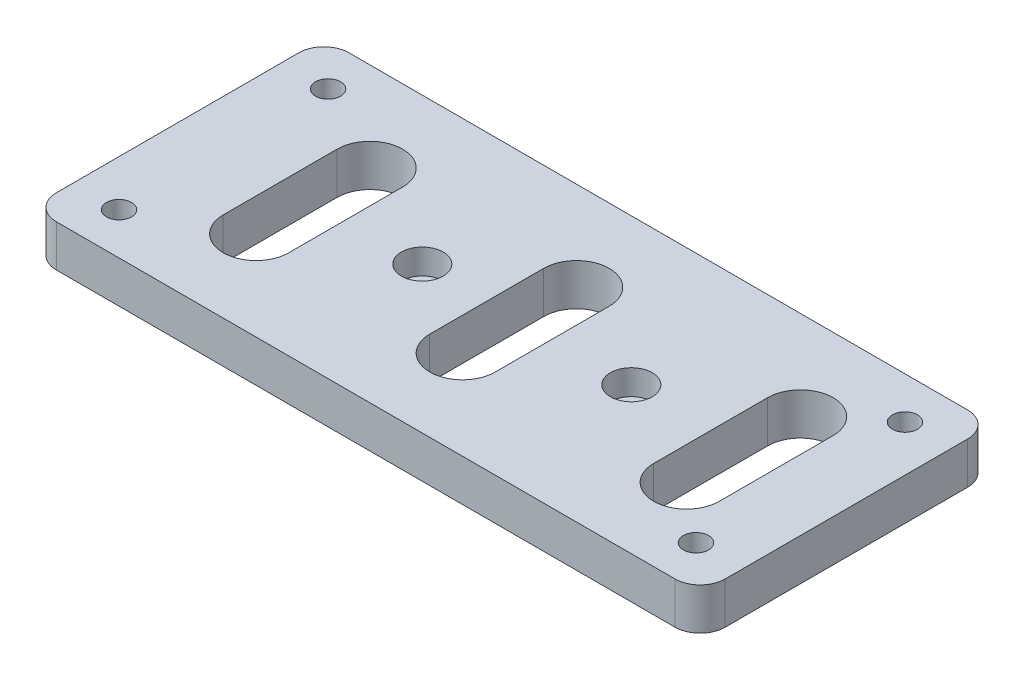
ISO-10303-21;
HEADER;
FILE_DESCRIPTION(('STEP AP214'),'2;1');
FILE_NAME('part.step','',(''),(''),'','','');
FILE_SCHEMA(('AUTOMOTIVE_DESIGN { 1 0 10303 214 1 1 1 1 }'));
ENDSEC;
DATA;
#1=APPLICATION_CONTEXT('core data for automotive mechanical design processes');
#2=APPLICATION_PROTOCOL_DEFINITION('international standard','automotive_design',2000,#1);
#3=PRODUCT_CONTEXT('',#1,'mechanical');
#4=PRODUCT('Part','Part','',(#3));
#5=PRODUCT_RELATED_PRODUCT_CATEGORY('part','',(#4));
#6=PRODUCT_DEFINITION_FORMATION('','',#4);
#7=PRODUCT_DEFINITION_CONTEXT('part definition',#1,'design');
#8=PRODUCT_DEFINITION('design','',#6,#7);
#9=PRODUCT_DEFINITION_SHAPE('','',#8);
#10=(LENGTH_UNIT() NAMED_UNIT(*) SI_UNIT(.MILLI.,.METRE.));
#11=(NAMED_UNIT(*) PLANE_ANGLE_UNIT() SI_UNIT($,.RADIAN.));
#12=(NAMED_UNIT(*) SI_UNIT($,.STERADIAN.) SOLID_ANGLE_UNIT());
#13=UNCERTAINTY_MEASURE_WITH_UNIT(LENGTH_MEASURE(1.E-05),#10,'distance_accuracy_value','');
#14=(GEOMETRIC_REPRESENTATION_CONTEXT(3) GLOBAL_UNCERTAINTY_ASSIGNED_CONTEXT((#13)) GLOBAL_UNIT_ASSIGNED_CONTEXT((#10,
#11,#12)) REPRESENTATION_CONTEXT('',''));
#15=CARTESIAN_POINT('',(0.,0.,0.));
#16=DIRECTION('',(0.,0.,1.));
#17=DIRECTION('',(1.,0.,0.));
#18=AXIS2_PLACEMENT_3D('',#15,#16,#17);
#19=CARTESIAN_POINT('',(54.270489511946,0.,-17.5));
#20=DIRECTION('',(0.,1.,0.));
#21=DIRECTION('',(0.,0.,1.));
#22=AXIS2_PLACEMENT_3D('',#19,#20,#21);
#23=CYLINDRICAL_SURFACE('',#22,1.29999999999999);
#24=CARTESIAN_POINT('',(54.270489511946,0.,-17.5));
#25=DIRECTION('',(0.,1.,0.));
#26=DIRECTION('',(0.,0.,1.));
#27=AXIS2_PLACEMENT_3D('',#24,#25,#26);
#28=CIRCLE('',#27,1.29999999999999);
#29=CARTESIAN_POINT('',(54.270489511946,0.,-16.2));
#30=VERTEX_POINT('',#29);
#31=EDGE_CURVE('E210',#30,#30,#28,.T.);
#32=ORIENTED_EDGE('',*,*,#31,.F.);
#33=EDGE_LOOP('',(#32));
#34=FACE_BOUND('',#33,.T.);
#35=CARTESIAN_POINT('',(54.270489511946,2.,-17.5));
#36=DIRECTION('',(0.,1.,0.));
#37=DIRECTION('',(0.,0.,1.));
#38=AXIS2_PLACEMENT_3D('',#35,#36,#37);
#39=CIRCLE('',#38,1.29999999999999);
#40=CARTESIAN_POINT('',(54.270489511946,2.,-16.2));
#41=VERTEX_POINT('',#40);
#42=EDGE_CURVE('E272',#41,#41,#39,.F.);
#43=ORIENTED_EDGE('',*,*,#42,.F.);
#44=EDGE_LOOP('',(#43));
#45=FACE_BOUND('',#44,.T.);
#46=ADVANCED_FACE('F33',(#34,#45),#23,.F.);
#47=CARTESIAN_POINT('',(29.270489511946,0.,-17.5));
#48=DIRECTION('',(0.,1.,0.));
#49=DIRECTION('',(0.,0.,1.));
#50=AXIS2_PLACEMENT_3D('',#47,#48,#49);
#51=CYLINDRICAL_SURFACE('',#50,1.3);
#52=CARTESIAN_POINT('',(29.270489511946,0.,-17.5));
#53=DIRECTION('',(0.,1.,0.));
#54=DIRECTION('',(0.,0.,1.));
#55=AXIS2_PLACEMENT_3D('',#52,#53,#54);
#56=CIRCLE('',#55,1.3);
#57=CARTESIAN_POINT('',(29.270489511946,0.,-16.2));
#58=VERTEX_POINT('',#57);
#59=EDGE_CURVE('E216',#58,#58,#56,.T.);
#60=ORIENTED_EDGE('',*,*,#59,.F.);
#61=EDGE_LOOP('',(#60));
#62=FACE_BOUND('',#61,.T.);
#63=CARTESIAN_POINT('',(29.270489511946,2.,-17.5));
#64=DIRECTION('',(0.,1.,0.));
#65=DIRECTION('',(0.,0.,1.));
#66=AXIS2_PLACEMENT_3D('',#63,#64,#65);
#67=CIRCLE('',#66,1.3);
#68=CARTESIAN_POINT('',(29.270489511946,2.,-16.2));
#69=VERTEX_POINT('',#68);
#70=EDGE_CURVE('E335',#69,#69,#67,.F.);
#71=ORIENTED_EDGE('',*,*,#70,.F.);
#72=EDGE_LOOP('',(#71));
#73=FACE_BOUND('',#72,.T.);
#74=ADVANCED_FACE('F408',(#62,#73),#51,.F.);
#75=CARTESIAN_POINT('',(0.,5.,0.));
#76=DIRECTION('',(1.,0.,0.));
#77=DIRECTION('',(0.,0.,-1.));
#78=AXIS2_PLACEMENT_3D('',#75,#76,#77);
#79=PLANE('',#78);
#80=DIRECTION('',(0.,0.,1.));
#81=VECTOR('',#80,1.);
#82=CARTESIAN_POINT('',(0.,5.,0.));
#83=LINE('',#82,#81);
#84=CARTESIAN_POINT('',(0.,5.,-32.));
#85=VERTEX_POINT('',#84);
#86=CARTESIAN_POINT('',(0.,5.,-3.));
#87=VERTEX_POINT('',#86);
#88=EDGE_CURVE('E314',#85,#87,#83,.T.);
#89=ORIENTED_EDGE('',*,*,#88,.F.);
#90=DIRECTION('',(0.,-1.,0.));
#91=VECTOR('',#90,1.);
#92=CARTESIAN_POINT('',(0.,5.,-32.));
#93=LINE('',#92,#91);
#94=CARTESIAN_POINT('',(0.,0.,-32.));
#95=VERTEX_POINT('',#94);
#96=EDGE_CURVE('E11',#85,#95,#93,.T.);
#97=ORIENTED_EDGE('',*,*,#96,.T.);
#98=DIRECTION('',(0.,0.,1.));
#99=VECTOR('',#98,1.);
#100=CARTESIAN_POINT('',(0.,0.,0.));
#101=LINE('',#100,#99);
#102=CARTESIAN_POINT('',(0.,0.,-3.));
#103=VERTEX_POINT('',#102);
#104=EDGE_CURVE('E311',#95,#103,#101,.T.);
#105=ORIENTED_EDGE('',*,*,#104,.T.);
#106=DIRECTION('',(0.,-1.,0.));
#107=VECTOR('',#106,1.);
#108=CARTESIAN_POINT('',(0.,5.,-3.));
#109=LINE('',#108,#107);
#110=EDGE_CURVE('E41',#103,#87,#109,.F.);
#111=ORIENTED_EDGE('',*,*,#110,.T.);
#112=EDGE_LOOP('',(#89,#97,#105,#111));
#113=FACE_BOUND('',#112,.T.);
#114=ADVANCED_FACE('F371',(#113),#79,.F.);
#115=CARTESIAN_POINT('',(0.,5.,0.));
#116=DIRECTION('',(0.,0.,-1.));
#117=DIRECTION('',(-1.,0.,0.));
#118=AXIS2_PLACEMENT_3D('',#115,#116,#117);
#119=PLANE('',#118);
#120=DIRECTION('',(1.,0.,0.));
#121=VECTOR('',#120,1.);
#122=CARTESIAN_POINT('',(0.,0.,0.));
#123=LINE('',#122,#121);
#124=CARTESIAN_POINT('',(3.,0.,0.));
#125=VERTEX_POINT('',#124);
#126=CARTESIAN_POINT('',(77.,0.,0.));
#127=VERTEX_POINT('',#126);
#128=EDGE_CURVE('E328',#125,#127,#123,.T.);
#129=ORIENTED_EDGE('',*,*,#128,.T.);
#130=DIRECTION('',(0.,-1.,0.));
#131=VECTOR('',#130,1.);
#132=CARTESIAN_POINT('',(77.,5.,0.));
#133=LINE('',#132,#131);
#134=CARTESIAN_POINT('',(77.,5.,0.));
#135=VERTEX_POINT('',#134);
#136=EDGE_CURVE('E356',#127,#135,#133,.F.);
#137=ORIENTED_EDGE('',*,*,#136,.T.);
#138=DIRECTION('',(1.,0.,0.));
#139=VECTOR('',#138,1.);
#140=CARTESIAN_POINT('',(0.,5.,0.));
#141=LINE('',#140,#139);
#142=CARTESIAN_POINT('',(3.,5.,0.));
#143=VERTEX_POINT('',#142);
#144=EDGE_CURVE('E317',#143,#135,#141,.T.);
#145=ORIENTED_EDGE('',*,*,#144,.F.);
#146=DIRECTION('',(0.,-1.,0.));
#147=VECTOR('',#146,1.);
#148=CARTESIAN_POINT('',(3.,5.,0.));
#149=LINE('',#148,#147);
#150=EDGE_CURVE('E353',#143,#125,#149,.T.);
#151=ORIENTED_EDGE('',*,*,#150,.T.);
#152=EDGE_LOOP('',(#129,#137,#145,#151));
#153=FACE_BOUND('',#152,.T.);
#154=ADVANCED_FACE('F382',(#153),#119,.F.);
#155=CARTESIAN_POINT('',(80.,5.,0.));
#156=DIRECTION('',(-1.,0.,0.));
#157=DIRECTION('',(0.,0.,1.));
#158=AXIS2_PLACEMENT_3D('',#155,#156,#157);
#159=PLANE('',#158);
#160=DIRECTION('',(0.,0.,-1.));
#161=VECTOR('',#160,1.);
#162=CARTESIAN_POINT('',(80.,5.,0.));
#163=LINE('',#162,#161);
#164=CARTESIAN_POINT('',(80.,5.,-3.));
#165=VERTEX_POINT('',#164);
#166=CARTESIAN_POINT('',(80.,5.,-32.));
#167=VERTEX_POINT('',#166);
#168=EDGE_CURVE('E321',#165,#167,#163,.T.);
#169=ORIENTED_EDGE('',*,*,#168,.F.);
#170=DIRECTION('',(0.,-1.,0.));
#171=VECTOR('',#170,1.);
#172=CARTESIAN_POINT('',(80.,5.,-3.));
#173=LINE('',#172,#171);
#174=CARTESIAN_POINT('',(80.,0.,-3.));
#175=VERTEX_POINT('',#174);
#176=EDGE_CURVE('E342',#165,#175,#173,.T.);
#177=ORIENTED_EDGE('',*,*,#176,.T.);
#178=DIRECTION('',(0.,0.,-1.));
#179=VECTOR('',#178,1.);
#180=CARTESIAN_POINT('',(80.,0.,0.));
#181=LINE('',#180,#179);
#182=CARTESIAN_POINT('',(80.,0.,-32.));
#183=VERTEX_POINT('',#182);
#184=EDGE_CURVE('E331',#175,#183,#181,.T.);
#185=ORIENTED_EDGE('',*,*,#184,.T.);
#186=DIRECTION('',(0.,-1.,0.));
#187=VECTOR('',#186,1.);
#188=CARTESIAN_POINT('',(80.,5.,-32.));
#189=LINE('',#188,#187);
#190=EDGE_CURVE('E325',#183,#167,#189,.F.);
#191=ORIENTED_EDGE('',*,*,#190,.T.);
#192=EDGE_LOOP('',(#169,#177,#185,#191));
#193=FACE_BOUND('',#192,.T.);
#194=ADVANCED_FACE('F392',(#193),#159,.F.);
#195=CARTESIAN_POINT('',(0.,5.,-35.));
#196=DIRECTION('',(0.,0.,1.));
#197=DIRECTION('',(1.,0.,0.));
#198=AXIS2_PLACEMENT_3D('',#195,#196,#197);
#199=PLANE('',#198);
#200=DIRECTION('',(-1.,0.,0.));
#201=VECTOR('',#200,1.);
#202=CARTESIAN_POINT('',(0.,5.,-35.));
#203=LINE('',#202,#201);
#204=CARTESIAN_POINT('',(77.,5.,-35.));
#205=VERTEX_POINT('',#204);
#206=CARTESIAN_POINT('',(3.,5.,-35.));
#207=VERTEX_POINT('',#206);
#208=EDGE_CURVE('E323',#205,#207,#203,.T.);
#209=ORIENTED_EDGE('',*,*,#208,.F.);
#210=DIRECTION('',(0.,-1.,0.));
#211=VECTOR('',#210,1.);
#212=CARTESIAN_POINT('',(77.,5.,-35.));
#213=LINE('',#212,#211);
#214=CARTESIAN_POINT('',(77.,0.,-35.));
#215=VERTEX_POINT('',#214);
#216=EDGE_CURVE('E366',#205,#215,#213,.T.);
#217=ORIENTED_EDGE('',*,*,#216,.T.);
#218=DIRECTION('',(-1.,0.,0.));
#219=VECTOR('',#218,1.);
#220=CARTESIAN_POINT('',(0.,0.,-35.));
#221=LINE('',#220,#219);
#222=CARTESIAN_POINT('',(3.,0.,-35.));
#223=VERTEX_POINT('',#222);
#224=EDGE_CURVE('E318',#215,#223,#221,.T.);
#225=ORIENTED_EDGE('',*,*,#224,.T.);
#226=DIRECTION('',(0.,-1.,0.));
#227=VECTOR('',#226,1.);
#228=CARTESIAN_POINT('',(3.,5.,-35.));
#229=LINE('',#228,#227);
#230=EDGE_CURVE('E48',#223,#207,#229,.F.);
#231=ORIENTED_EDGE('',*,*,#230,.T.);
#232=EDGE_LOOP('',(#209,#217,#225,#231));
#233=FACE_BOUND('',#232,.T.);
#234=ADVANCED_FACE('F398',(#233),#199,.F.);
#235=CARTESIAN_POINT('',(0.,5.,0.));
#236=DIRECTION('',(0.,-1.,0.));
#237=DIRECTION('',(0.,0.,-1.));
#238=AXIS2_PLACEMENT_3D('',#235,#236,#237);
#239=PLANE('',#238);
#240=CARTESIAN_POINT('',(29.270489511946,5.,-17.5));
#241=DIRECTION('',(0.,1.,0.));
#242=DIRECTION('',(0.,0.,1.));
#243=AXIS2_PLACEMENT_3D('',#240,#241,#242);
#244=CIRCLE('',#243,2.49999999999999);
#245=CARTESIAN_POINT('',(29.270489511946,5.,-15.));
#246=VERTEX_POINT('',#245);
#247=EDGE_CURVE('E705',#246,#246,#244,.T.);
#248=ORIENTED_EDGE('',*,*,#247,.F.);
#249=EDGE_LOOP('',(#248));
#250=FACE_BOUND('',#249,.T.);
#251=CARTESIAN_POINT('',(54.270489511946,5.,-17.5));
#252=DIRECTION('',(0.,1.,0.));
#253=DIRECTION('',(0.,0.,1.));
#254=AXIS2_PLACEMENT_3D('',#251,#252,#253);
#255=CIRCLE('',#254,2.49999999999999);
#256=CARTESIAN_POINT('',(54.270489511946,5.,-15.));
#257=VERTEX_POINT('',#256);
#258=EDGE_CURVE('E203',#257,#257,#255,.T.);
#259=ORIENTED_EDGE('',*,*,#258,.F.);
#260=EDGE_LOOP('',(#259));
#261=FACE_BOUND('',#260,.T.);
#262=CARTESIAN_POINT('',(74.5,5.,-30.));
#263=DIRECTION('',(0.,1.,0.));
#264=DIRECTION('',(0.,0.,1.));
#265=AXIS2_PLACEMENT_3D('',#262,#263,#264);
#266=CIRCLE('',#265,1.5);
#267=CARTESIAN_POINT('',(74.5,5.,-28.5));
#268=VERTEX_POINT('',#267);
#269=EDGE_CURVE('E291',#268,#268,#266,.T.);
#270=ORIENTED_EDGE('',*,*,#269,.F.);
#271=EDGE_LOOP('',(#270));
#272=FACE_BOUND('',#271,.T.);
#273=CARTESIAN_POINT('',(74.5,5.,-5.));
#274=DIRECTION('',(0.,1.,0.));
#275=DIRECTION('',(0.,0.,1.));
#276=AXIS2_PLACEMENT_3D('',#273,#274,#275);
#277=CIRCLE('',#276,1.5);
#278=CARTESIAN_POINT('',(74.5,5.,-3.5));
#279=VERTEX_POINT('',#278);
#280=EDGE_CURVE('E297',#279,#279,#277,.T.);
#281=ORIENTED_EDGE('',*,*,#280,.F.);
#282=EDGE_LOOP('',(#281));
#283=FACE_BOUND('',#282,.T.);
#284=CARTESIAN_POINT('',(5.49999999999999,5.,-5.));
#285=DIRECTION('',(0.,1.,0.));
#286=DIRECTION('',(0.,0.,1.));
#287=AXIS2_PLACEMENT_3D('',#284,#285,#286);
#288=CIRCLE('',#287,1.5);
#289=CARTESIAN_POINT('',(5.49999999999999,5.,-3.5));
#290=VERTEX_POINT('',#289);
#291=EDGE_CURVE('E303',#290,#290,#288,.T.);
#292=ORIENTED_EDGE('',*,*,#291,.F.);
#293=EDGE_LOOP('',(#292));
#294=FACE_BOUND('',#293,.T.);
#295=DIRECTION('',(0.,0.,1.));
#296=VECTOR('',#295,1.);
#297=CARTESIAN_POINT('',(63.7583956599308,5.,-24.3103814107303));
#298=LINE('',#297,#296);
#299=CARTESIAN_POINT('',(63.7583956599308,5.,-24.3103814107303));
#300=VERTEX_POINT('',#299);
#301=CARTESIAN_POINT('',(63.7583956599308,5.,-10.6896185892697));
#302=VERTEX_POINT('',#301);
#303=EDGE_CURVE('E209',#300,#302,#298,.T.);
#304=ORIENTED_EDGE('',*,*,#303,.F.);
#305=CARTESIAN_POINT('',(67.6804486617196,5.,-24.3103814107303));
#306=DIRECTION('',(0.,1.,0.));
#307=DIRECTION('',(0.,0.,1.));
#308=AXIS2_PLACEMENT_3D('',#305,#306,#307);
#309=CIRCLE('',#308,3.92205300178881);
#310=CARTESIAN_POINT('',(71.6025016635084,5.,-24.3103814107303));
#311=VERTEX_POINT('',#310);
#312=EDGE_CURVE('E179',#311,#300,#309,.T.);
#313=ORIENTED_EDGE('',*,*,#312,.F.);
#314=DIRECTION('',(0.,0.,-1.));
#315=VECTOR('',#314,1.);
#316=CARTESIAN_POINT('',(71.6025016635084,5.,-24.3103814107303));
#317=LINE('',#316,#315);
#318=CARTESIAN_POINT('',(71.6025016635084,5.,-10.6896185892697));
#319=VERTEX_POINT('',#318);
#320=EDGE_CURVE('E197',#319,#311,#317,.T.);
#321=ORIENTED_EDGE('',*,*,#320,.F.);
#322=CARTESIAN_POINT('',(67.6804486617196,5.,-10.6896185892697));
#323=DIRECTION('',(0.,1.,0.));
#324=DIRECTION('',(0.,0.,1.));
#325=AXIS2_PLACEMENT_3D('',#322,#323,#324);
#326=CIRCLE('',#325,3.92205300178881);
#327=EDGE_CURVE('E200',#302,#319,#326,.T.);
#328=ORIENTED_EDGE('',*,*,#327,.F.);
#329=EDGE_LOOP('',(#304,#313,#321,#328));
#330=FACE_BOUND('',#329,.T.);
#331=DIRECTION('',(0.,0.,1.));
#332=VECTOR('',#331,1.);
#333=CARTESIAN_POINT('',(36.9716081370752,5.,-24.3103814107303));
#334=LINE('',#333,#332);
#335=CARTESIAN_POINT('',(36.9716081370752,5.,-24.3103814107303));
#336=VERTEX_POINT('',#335);
#337=CARTESIAN_POINT('',(36.9716081370752,5.,-10.6896185892697));
#338=VERTEX_POINT('',#337);
#339=EDGE_CURVE('E239',#336,#338,#334,.T.);
#340=ORIENTED_EDGE('',*,*,#339,.F.);
#341=CARTESIAN_POINT('',(40.8936611388641,5.,-24.3103814107303));
#342=DIRECTION('',(0.,1.,0.));
#343=DIRECTION('',(0.,0.,1.));
#344=AXIS2_PLACEMENT_3D('',#341,#342,#343);
#345=CIRCLE('',#344,3.92205300178882);
#346=CARTESIAN_POINT('',(44.8157141406529,5.,-24.3103814107303));
#347=VERTEX_POINT('',#346);
#348=EDGE_CURVE('E237',#347,#336,#345,.T.);
#349=ORIENTED_EDGE('',*,*,#348,.F.);
#350=DIRECTION('',(0.,0.,-1.));
#351=VECTOR('',#350,1.);
#352=CARTESIAN_POINT('',(44.8157141406529,5.,-24.3103814107303));
#353=LINE('',#352,#351);
#354=CARTESIAN_POINT('',(44.8157141406529,5.,-10.6896185892697));
#355=VERTEX_POINT('',#354);
#356=EDGE_CURVE('E227',#355,#347,#353,.T.);
#357=ORIENTED_EDGE('',*,*,#356,.F.);
#358=CARTESIAN_POINT('',(40.8936611388641,5.,-10.6896185892697));
#359=DIRECTION('',(0.,1.,0.));
#360=DIRECTION('',(0.,0.,1.));
#361=AXIS2_PLACEMENT_3D('',#358,#359,#360);
#362=CIRCLE('',#361,3.92205300178882);
#363=EDGE_CURVE('E243',#338,#355,#362,.T.);
#364=ORIENTED_EDGE('',*,*,#363,.F.);
#365=EDGE_LOOP('',(#340,#349,#357,#364));
#366=FACE_BOUND('',#365,.T.);
#367=DIRECTION('',(0.,0.,1.));
#368=VECTOR('',#367,1.);
#369=CARTESIAN_POINT('',(12.2710190194265,5.,-24.3103814107303));
#370=LINE('',#369,#368);
#371=CARTESIAN_POINT('',(12.2710190194265,5.,-24.3103814107303));
#372=VERTEX_POINT('',#371);
#373=CARTESIAN_POINT('',(12.2710190194265,5.,-10.6896185892697));
#374=VERTEX_POINT('',#373);
#375=EDGE_CURVE('E271',#372,#374,#370,.T.);
#376=ORIENTED_EDGE('',*,*,#375,.F.);
#377=CARTESIAN_POINT('',(16.1930720212153,5.,-24.3103814107303));
#378=DIRECTION('',(0.,1.,0.));
#379=DIRECTION('',(0.,0.,1.));
#380=AXIS2_PLACEMENT_3D('',#377,#378,#379);
#381=CIRCLE('',#380,3.92205300178881);
#382=CARTESIAN_POINT('',(20.1151250230041,5.,-24.3103814107303));
#383=VERTEX_POINT('',#382);
#384=EDGE_CURVE('E269',#383,#372,#381,.T.);
#385=ORIENTED_EDGE('',*,*,#384,.F.);
#386=DIRECTION('',(0.,0.,-1.));
#387=VECTOR('',#386,1.);
#388=CARTESIAN_POINT('',(20.1151250230041,5.,-24.3103814107303));
#389=LINE('',#388,#387);
#390=CARTESIAN_POINT('',(20.1151250230041,5.,-10.6896185892697));
#391=VERTEX_POINT('',#390);
#392=EDGE_CURVE('E259',#391,#383,#389,.T.);
#393=ORIENTED_EDGE('',*,*,#392,.F.);
#394=CARTESIAN_POINT('',(16.1930720212153,5.,-10.6896185892697));
#395=DIRECTION('',(0.,1.,0.));
#396=DIRECTION('',(0.,0.,1.));
#397=AXIS2_PLACEMENT_3D('',#394,#395,#396);
#398=CIRCLE('',#397,3.92205300178881);
#399=EDGE_CURVE('E275',#374,#391,#398,.T.);
#400=ORIENTED_EDGE('',*,*,#399,.F.);
#401=EDGE_LOOP('',(#376,#385,#393,#400));
#402=FACE_BOUND('',#401,.T.);
#403=CARTESIAN_POINT('',(5.49999999999999,5.,-30.));
#404=DIRECTION('',(0.,1.,0.));
#405=DIRECTION('',(0.,0.,1.));
#406=AXIS2_PLACEMENT_3D('',#403,#404,#405);
#407=CIRCLE('',#406,1.5);
#408=CARTESIAN_POINT('',(5.49999999999999,5.,-28.5));
#409=VERTEX_POINT('',#408);
#410=EDGE_CURVE('E290',#409,#409,#407,.T.);
#411=ORIENTED_EDGE('',*,*,#410,.F.);
#412=EDGE_LOOP('',(#411));
#413=FACE_BOUND('',#412,.T.);
#414=ORIENTED_EDGE('',*,*,#144,.T.);
#415=CARTESIAN_POINT('',(77.,5.,-3.));
#416=DIRECTION('',(0.,-1.,0.));
#417=DIRECTION('',(0.,0.,-1.));
#418=AXIS2_PLACEMENT_3D('',#415,#416,#417);
#419=CIRCLE('',#418,3.);
#420=EDGE_CURVE('E363',#135,#165,#419,.F.);
#421=ORIENTED_EDGE('',*,*,#420,.T.);
#422=ORIENTED_EDGE('',*,*,#168,.T.);
#423=CARTESIAN_POINT('',(77.,5.,-32.));
#424=DIRECTION('',(0.,-1.,0.));
#425=DIRECTION('',(0.,0.,-1.));
#426=AXIS2_PLACEMENT_3D('',#423,#424,#425);
#427=CIRCLE('',#426,3.);
#428=EDGE_CURVE('E55',#167,#205,#427,.F.);
#429=ORIENTED_EDGE('',*,*,#428,.T.);
#430=ORIENTED_EDGE('',*,*,#208,.T.);
#431=CARTESIAN_POINT('',(3.,5.,-32.));
#432=DIRECTION('',(0.,-1.,0.));
#433=DIRECTION('',(0.,0.,-1.));
#434=AXIS2_PLACEMENT_3D('',#431,#432,#433);
#435=CIRCLE('',#434,3.);
#436=EDGE_CURVE('E360',#207,#85,#435,.F.);
#437=ORIENTED_EDGE('',*,*,#436,.T.);
#438=ORIENTED_EDGE('',*,*,#88,.T.);
#439=CARTESIAN_POINT('',(3.,5.,-3.));
#440=DIRECTION('',(0.,-1.,0.));
#441=DIRECTION('',(0.,0.,-1.));
#442=AXIS2_PLACEMENT_3D('',#439,#440,#441);
#443=CIRCLE('',#442,3.);
#444=EDGE_CURVE('E358',#87,#143,#443,.F.);
#445=ORIENTED_EDGE('',*,*,#444,.T.);
#446=EDGE_LOOP('',(#414,#421,#422,#429,#430,#437,#438,#445));
#447=FACE_BOUND('',#446,.T.);
#448=ADVANCED_FACE('F376',(#250,#261,#272,#283,#294,#330,#366,#402,#413,#447),#239,.F.);
#449=CARTESIAN_POINT('',(0.,0.,0.));
#450=DIRECTION('',(0.,-1.,0.));
#451=DIRECTION('',(0.,0.,-1.));
#452=AXIS2_PLACEMENT_3D('',#449,#450,#451);
#453=PLANE('',#452);
#454=CARTESIAN_POINT('',(74.5,0.,-30.));
#455=DIRECTION('',(0.,1.,0.));
#456=DIRECTION('',(0.,0.,1.));
#457=AXIS2_PLACEMENT_3D('',#454,#455,#456);
#458=CIRCLE('',#457,1.5);
#459=CARTESIAN_POINT('',(74.5,0.,-28.5));
#460=VERTEX_POINT('',#459);
#461=EDGE_CURVE('E287',#460,#460,#458,.T.);
#462=ORIENTED_EDGE('',*,*,#461,.T.);
#463=EDGE_LOOP('',(#462));
#464=FACE_BOUND('',#463,.T.);
#465=CARTESIAN_POINT('',(74.5,0.,-5.));
#466=DIRECTION('',(0.,1.,0.));
#467=DIRECTION('',(0.,0.,1.));
#468=AXIS2_PLACEMENT_3D('',#465,#466,#467);
#469=CIRCLE('',#468,1.5);
#470=CARTESIAN_POINT('',(74.5,0.,-3.5));
#471=VERTEX_POINT('',#470);
#472=EDGE_CURVE('E294',#471,#471,#469,.T.);
#473=ORIENTED_EDGE('',*,*,#472,.T.);
#474=EDGE_LOOP('',(#473));
#475=FACE_BOUND('',#474,.T.);
#476=CARTESIAN_POINT('',(5.49999999999999,0.,-5.));
#477=DIRECTION('',(0.,1.,0.));
#478=DIRECTION('',(0.,0.,1.));
#479=AXIS2_PLACEMENT_3D('',#476,#477,#478);
#480=CIRCLE('',#479,1.5);
#481=CARTESIAN_POINT('',(5.49999999999999,0.,-3.5));
#482=VERTEX_POINT('',#481);
#483=EDGE_CURVE('E300',#482,#482,#480,.T.);
#484=ORIENTED_EDGE('',*,*,#483,.T.);
#485=EDGE_LOOP('',(#484));
#486=FACE_BOUND('',#485,.T.);
#487=ORIENTED_EDGE('',*,*,#59,.T.);
#488=EDGE_LOOP('',(#487));
#489=FACE_BOUND('',#488,.T.);
#490=CARTESIAN_POINT('',(67.6804486617196,0.,-24.3103814107303));
#491=DIRECTION('',(0.,1.,0.));
#492=DIRECTION('',(0.,0.,1.));
#493=AXIS2_PLACEMENT_3D('',#490,#491,#492);
#494=CIRCLE('',#493,3.92205300178881);
#495=CARTESIAN_POINT('',(71.6025016635084,0.,-24.3103814107303));
#496=VERTEX_POINT('',#495);
#497=CARTESIAN_POINT('',(63.7583956599308,0.,-24.3103814107303));
#498=VERTEX_POINT('',#497);
#499=EDGE_CURVE('E176',#496,#498,#494,.T.);
#500=ORIENTED_EDGE('',*,*,#499,.T.);
#501=DIRECTION('',(0.,0.,1.));
#502=VECTOR('',#501,1.);
#503=CARTESIAN_POINT('',(63.7583956599308,0.,-24.3103814107303));
#504=LINE('',#503,#502);
#505=CARTESIAN_POINT('',(63.7583956599308,0.,-10.6896185892697));
#506=VERTEX_POINT('',#505);
#507=EDGE_CURVE('E188',#498,#506,#504,.T.);
#508=ORIENTED_EDGE('',*,*,#507,.T.);
#509=CARTESIAN_POINT('',(67.6804486617196,0.,-10.6896185892697));
#510=DIRECTION('',(0.,1.,0.));
#511=DIRECTION('',(0.,0.,1.));
#512=AXIS2_PLACEMENT_3D('',#509,#510,#511);
#513=CIRCLE('',#512,3.92205300178881);
#514=CARTESIAN_POINT('',(71.6025016635084,0.,-10.6896185892697));
#515=VERTEX_POINT('',#514);
#516=EDGE_CURVE('E192',#506,#515,#513,.T.);
#517=ORIENTED_EDGE('',*,*,#516,.T.);
#518=DIRECTION('',(0.,0.,-1.));
#519=VECTOR('',#518,1.);
#520=CARTESIAN_POINT('',(71.6025016635084,0.,-24.3103814107303));
#521=LINE('',#520,#519);
#522=EDGE_CURVE('E184',#515,#496,#521,.T.);
#523=ORIENTED_EDGE('',*,*,#522,.T.);
#524=EDGE_LOOP('',(#500,#508,#517,#523));
#525=FACE_BOUND('',#524,.T.);
#526=ORIENTED_EDGE('',*,*,#31,.T.);
#527=EDGE_LOOP('',(#526));
#528=FACE_BOUND('',#527,.T.);
#529=CARTESIAN_POINT('',(40.8936611388641,0.,-24.3103814107303));
#530=DIRECTION('',(0.,1.,0.));
#531=DIRECTION('',(0.,0.,1.));
#532=AXIS2_PLACEMENT_3D('',#529,#530,#531);
#533=CIRCLE('',#532,3.92205300178882);
#534=CARTESIAN_POINT('',(44.8157141406529,0.,-24.3103814107303));
#535=VERTEX_POINT('',#534);
#536=CARTESIAN_POINT('',(36.9716081370752,0.,-24.3103814107303));
#537=VERTEX_POINT('',#536);
#538=EDGE_CURVE('E223',#535,#537,#533,.T.);
#539=ORIENTED_EDGE('',*,*,#538,.T.);
#540=DIRECTION('',(0.,0.,1.));
#541=VECTOR('',#540,1.);
#542=CARTESIAN_POINT('',(36.9716081370752,0.,-24.3103814107303));
#543=LINE('',#542,#541);
#544=CARTESIAN_POINT('',(36.9716081370752,0.,-10.6896185892697));
#545=VERTEX_POINT('',#544);
#546=EDGE_CURVE('E226',#537,#545,#543,.T.);
#547=ORIENTED_EDGE('',*,*,#546,.T.);
#548=CARTESIAN_POINT('',(40.8936611388641,0.,-10.6896185892697));
#549=DIRECTION('',(0.,1.,0.));
#550=DIRECTION('',(0.,0.,1.));
#551=AXIS2_PLACEMENT_3D('',#548,#549,#550);
#552=CIRCLE('',#551,3.92205300178882);
#553=CARTESIAN_POINT('',(44.8157141406529,0.,-10.6896185892697));
#554=VERTEX_POINT('',#553);
#555=EDGE_CURVE('E230',#545,#554,#552,.T.);
#556=ORIENTED_EDGE('',*,*,#555,.T.);
#557=DIRECTION('',(0.,0.,-1.));
#558=VECTOR('',#557,1.);
#559=CARTESIAN_POINT('',(44.8157141406529,0.,-24.3103814107303));
#560=LINE('',#559,#558);
#561=EDGE_CURVE('E233',#554,#535,#560,.T.);
#562=ORIENTED_EDGE('',*,*,#561,.T.);
#563=EDGE_LOOP('',(#539,#547,#556,#562));
#564=FACE_BOUND('',#563,.T.);
#565=CARTESIAN_POINT('',(16.1930720212153,0.,-24.3103814107303));
#566=DIRECTION('',(0.,1.,0.));
#567=DIRECTION('',(0.,0.,1.));
#568=AXIS2_PLACEMENT_3D('',#565,#566,#567);
#569=CIRCLE('',#568,3.92205300178881);
#570=CARTESIAN_POINT('',(20.1151250230041,0.,-24.3103814107303));
#571=VERTEX_POINT('',#570);
#572=CARTESIAN_POINT('',(12.2710190194265,0.,-24.3103814107303));
#573=VERTEX_POINT('',#572);
#574=EDGE_CURVE('E255',#571,#573,#569,.T.);
#575=ORIENTED_EDGE('',*,*,#574,.T.);
#576=DIRECTION('',(0.,0.,1.));
#577=VECTOR('',#576,1.);
#578=CARTESIAN_POINT('',(12.2710190194265,0.,-24.3103814107303));
#579=LINE('',#578,#577);
#580=CARTESIAN_POINT('',(12.2710190194265,0.,-10.6896185892697));
#581=VERTEX_POINT('',#580);
#582=EDGE_CURVE('E258',#573,#581,#579,.T.);
#583=ORIENTED_EDGE('',*,*,#582,.T.);
#584=CARTESIAN_POINT('',(16.1930720212153,0.,-10.6896185892697));
#585=DIRECTION('',(0.,1.,0.));
#586=DIRECTION('',(0.,0.,1.));
#587=AXIS2_PLACEMENT_3D('',#584,#585,#586);
#588=CIRCLE('',#587,3.92205300178881);
#589=CARTESIAN_POINT('',(20.1151250230041,0.,-10.6896185892697));
#590=VERTEX_POINT('',#589);
#591=EDGE_CURVE('E262',#581,#590,#588,.T.);
#592=ORIENTED_EDGE('',*,*,#591,.T.);
#593=DIRECTION('',(0.,0.,-1.));
#594=VECTOR('',#593,1.);
#595=CARTESIAN_POINT('',(20.1151250230041,0.,-24.3103814107303));
#596=LINE('',#595,#594);
#597=EDGE_CURVE('E265',#590,#571,#596,.T.);
#598=ORIENTED_EDGE('',*,*,#597,.T.);
#599=EDGE_LOOP('',(#575,#583,#592,#598));
#600=FACE_BOUND('',#599,.T.);
#601=CARTESIAN_POINT('',(5.49999999999999,0.,-30.));
#602=DIRECTION('',(0.,1.,0.));
#603=DIRECTION('',(0.,0.,1.));
#604=AXIS2_PLACEMENT_3D('',#601,#602,#603);
#605=CIRCLE('',#604,1.5);
#606=CARTESIAN_POINT('',(5.49999999999999,0.,-28.5));
#607=VERTEX_POINT('',#606);
#608=EDGE_CURVE('E308',#607,#607,#605,.T.);
#609=ORIENTED_EDGE('',*,*,#608,.T.);
#610=EDGE_LOOP('',(#609));
#611=FACE_BOUND('',#610,.T.);
#612=ORIENTED_EDGE('',*,*,#184,.F.);
#613=CARTESIAN_POINT('',(77.,0.,-3.));
#614=DIRECTION('',(0.,-1.,0.));
#615=DIRECTION('',(0.,0.,-1.));
#616=AXIS2_PLACEMENT_3D('',#613,#614,#615);
#617=CIRCLE('',#616,3.);
#618=EDGE_CURVE('E351',#175,#127,#617,.T.);
#619=ORIENTED_EDGE('',*,*,#618,.T.);
#620=ORIENTED_EDGE('',*,*,#128,.F.);
#621=CARTESIAN_POINT('',(3.,0.,-3.));
#622=DIRECTION('',(0.,-1.,0.));
#623=DIRECTION('',(0.,0.,-1.));
#624=AXIS2_PLACEMENT_3D('',#621,#622,#623);
#625=CIRCLE('',#624,3.);
#626=EDGE_CURVE('E345',#125,#103,#625,.T.);
#627=ORIENTED_EDGE('',*,*,#626,.T.);
#628=ORIENTED_EDGE('',*,*,#104,.F.);
#629=CARTESIAN_POINT('',(3.,0.,-32.));
#630=DIRECTION('',(0.,-1.,0.));
#631=DIRECTION('',(0.,0.,-1.));
#632=AXIS2_PLACEMENT_3D('',#629,#630,#631);
#633=CIRCLE('',#632,3.);
#634=EDGE_CURVE('E347',#95,#223,#633,.T.);
#635=ORIENTED_EDGE('',*,*,#634,.T.);
#636=ORIENTED_EDGE('',*,*,#224,.F.);
#637=CARTESIAN_POINT('',(77.,0.,-32.));
#638=DIRECTION('',(0.,-1.,0.));
#639=DIRECTION('',(0.,0.,-1.));
#640=AXIS2_PLACEMENT_3D('',#637,#638,#639);
#641=CIRCLE('',#640,3.);
#642=EDGE_CURVE('E349',#215,#183,#641,.T.);
#643=ORIENTED_EDGE('',*,*,#642,.T.);
#644=EDGE_LOOP('',(#612,#619,#620,#627,#628,#635,#636,#643));
#645=FACE_BOUND('',#644,.T.);
#646=ADVANCED_FACE('F194',(#464,#475,#486,#489,#525,#528,#564,#600,#611,#645),#453,.T.);
#647=CARTESIAN_POINT('',(5.49999999999999,0.,-30.));
#648=DIRECTION('',(0.,1.,0.));
#649=DIRECTION('',(0.,0.,1.));
#650=AXIS2_PLACEMENT_3D('',#647,#648,#649);
#651=CYLINDRICAL_SURFACE('',#650,1.5);
#652=ORIENTED_EDGE('',*,*,#608,.F.);
#653=EDGE_LOOP('',(#652));
#654=FACE_BOUND('',#653,.T.);
#655=ORIENTED_EDGE('',*,*,#410,.T.);
#656=EDGE_LOOP('',(#655));
#657=FACE_BOUND('',#656,.T.);
#658=ADVANCED_FACE('F452',(#654,#657),#651,.F.);
#659=CARTESIAN_POINT('',(16.1930720212153,0.,-24.3103814107303));
#660=DIRECTION('',(0.,1.,0.));
#661=DIRECTION('',(0.,0.,1.));
#662=AXIS2_PLACEMENT_3D('',#659,#660,#661);
#663=CYLINDRICAL_SURFACE('',#662,3.92205300178881);
#664=ORIENTED_EDGE('',*,*,#384,.T.);
#665=DIRECTION('',(0.,1.,0.));
#666=VECTOR('',#665,1.);
#667=CARTESIAN_POINT('',(12.2710190194265,0.,-24.3103814107303));
#668=LINE('',#667,#666);
#669=EDGE_CURVE('E268',#573,#372,#668,.T.);
#670=ORIENTED_EDGE('',*,*,#669,.F.);
#671=ORIENTED_EDGE('',*,*,#574,.F.);
#672=DIRECTION('',(0.,1.,0.));
#673=VECTOR('',#672,1.);
#674=CARTESIAN_POINT('',(20.1151250230041,0.,-24.3103814107303));
#675=LINE('',#674,#673);
#676=EDGE_CURVE('E240',#571,#383,#675,.T.);
#677=ORIENTED_EDGE('',*,*,#676,.T.);
#678=EDGE_LOOP('',(#664,#670,#671,#677));
#679=FACE_BOUND('',#678,.T.);
#680=ADVANCED_FACE('F442',(#679),#663,.F.);
#681=CARTESIAN_POINT('',(20.1151250230041,0.,-24.3103814107303));
#682=DIRECTION('',(1.,0.,0.));
#683=DIRECTION('',(0.,0.,-1.));
#684=AXIS2_PLACEMENT_3D('',#681,#682,#683);
#685=PLANE('',#684);
#686=ORIENTED_EDGE('',*,*,#392,.T.);
#687=ORIENTED_EDGE('',*,*,#676,.F.);
#688=ORIENTED_EDGE('',*,*,#597,.F.);
#689=DIRECTION('',(0.,1.,0.));
#690=VECTOR('',#689,1.);
#691=CARTESIAN_POINT('',(20.1151250230041,0.,-10.6896185892697));
#692=LINE('',#691,#690);
#693=EDGE_CURVE('E281',#590,#391,#692,.T.);
#694=ORIENTED_EDGE('',*,*,#693,.T.);
#695=EDGE_LOOP('',(#686,#687,#688,#694));
#696=FACE_BOUND('',#695,.T.);
#697=ADVANCED_FACE('F438',(#696),#685,.F.);
#698=CARTESIAN_POINT('',(16.1930720212153,0.,-10.6896185892697));
#699=DIRECTION('',(0.,1.,0.));
#700=DIRECTION('',(0.,0.,1.));
#701=AXIS2_PLACEMENT_3D('',#698,#699,#700);
#702=CYLINDRICAL_SURFACE('',#701,3.92205300178881);
#703=ORIENTED_EDGE('',*,*,#399,.T.);
#704=ORIENTED_EDGE('',*,*,#693,.F.);
#705=ORIENTED_EDGE('',*,*,#591,.F.);
#706=DIRECTION('',(0.,1.,0.));
#707=VECTOR('',#706,1.);
#708=CARTESIAN_POINT('',(12.2710190194265,0.,-10.6896185892697));
#709=LINE('',#708,#707);
#710=EDGE_CURVE('E283',#581,#374,#709,.T.);
#711=ORIENTED_EDGE('',*,*,#710,.T.);
#712=EDGE_LOOP('',(#703,#704,#705,#711));
#713=FACE_BOUND('',#712,.T.);
#714=ADVANCED_FACE('F441',(#713),#702,.F.);
#715=CARTESIAN_POINT('',(12.2710190194265,0.,-24.3103814107303));
#716=DIRECTION('',(-1.,0.,0.));
#717=DIRECTION('',(0.,0.,1.));
#718=AXIS2_PLACEMENT_3D('',#715,#716,#717);
#719=PLANE('',#718);
#720=ORIENTED_EDGE('',*,*,#375,.T.);
#721=ORIENTED_EDGE('',*,*,#710,.F.);
#722=ORIENTED_EDGE('',*,*,#582,.F.);
#723=ORIENTED_EDGE('',*,*,#669,.T.);
#724=EDGE_LOOP('',(#720,#721,#722,#723));
#725=FACE_BOUND('',#724,.T.);
#726=ADVANCED_FACE('F436',(#725),#719,.F.);
#727=CARTESIAN_POINT('',(40.8936611388641,0.,-24.3103814107303));
#728=DIRECTION('',(0.,1.,0.));
#729=DIRECTION('',(0.,0.,1.));
#730=AXIS2_PLACEMENT_3D('',#727,#728,#729);
#731=CYLINDRICAL_SURFACE('',#730,3.92205300178882);
#732=ORIENTED_EDGE('',*,*,#348,.T.);
#733=DIRECTION('',(0.,1.,0.));
#734=VECTOR('',#733,1.);
#735=CARTESIAN_POINT('',(36.9716081370752,0.,-24.3103814107303));
#736=LINE('',#735,#734);
#737=EDGE_CURVE('E236',#537,#336,#736,.T.);
#738=ORIENTED_EDGE('',*,*,#737,.F.);
#739=ORIENTED_EDGE('',*,*,#538,.F.);
#740=DIRECTION('',(0.,1.,0.));
#741=VECTOR('',#740,1.);
#742=CARTESIAN_POINT('',(44.8157141406529,0.,-24.3103814107303));
#743=LINE('',#742,#741);
#744=EDGE_CURVE('E222',#535,#347,#743,.T.);
#745=ORIENTED_EDGE('',*,*,#744,.T.);
#746=EDGE_LOOP('',(#732,#738,#739,#745));
#747=FACE_BOUND('',#746,.T.);
#748=ADVANCED_FACE('F425',(#747),#731,.F.);
#749=CARTESIAN_POINT('',(44.8157141406529,0.,-24.3103814107303));
#750=DIRECTION('',(1.,0.,0.));
#751=DIRECTION('',(0.,0.,-1.));
#752=AXIS2_PLACEMENT_3D('',#749,#750,#751);
#753=PLANE('',#752);
#754=ORIENTED_EDGE('',*,*,#356,.T.);
#755=ORIENTED_EDGE('',*,*,#744,.F.);
#756=ORIENTED_EDGE('',*,*,#561,.F.);
#757=DIRECTION('',(0.,1.,0.));
#758=VECTOR('',#757,1.);
#759=CARTESIAN_POINT('',(44.8157141406529,0.,-10.6896185892697));
#760=LINE('',#759,#758);
#761=EDGE_CURVE('E249',#554,#355,#760,.T.);
#762=ORIENTED_EDGE('',*,*,#761,.T.);
#763=EDGE_LOOP('',(#754,#755,#756,#762));
#764=FACE_BOUND('',#763,.T.);
#765=ADVANCED_FACE('F421',(#764),#753,.F.);
#766=CARTESIAN_POINT('',(40.8936611388641,0.,-10.6896185892697));
#767=DIRECTION('',(0.,1.,0.));
#768=DIRECTION('',(0.,0.,1.));
#769=AXIS2_PLACEMENT_3D('',#766,#767,#768);
#770=CYLINDRICAL_SURFACE('',#769,3.92205300178882);
#771=ORIENTED_EDGE('',*,*,#363,.T.);
#772=ORIENTED_EDGE('',*,*,#761,.F.);
#773=ORIENTED_EDGE('',*,*,#555,.F.);
#774=DIRECTION('',(0.,1.,0.));
#775=VECTOR('',#774,1.);
#776=CARTESIAN_POINT('',(36.9716081370752,0.,-10.6896185892697));
#777=LINE('',#776,#775);
#778=EDGE_CURVE('E251',#545,#338,#777,.T.);
#779=ORIENTED_EDGE('',*,*,#778,.T.);
#780=EDGE_LOOP('',(#771,#772,#773,#779));
#781=FACE_BOUND('',#780,.T.);
#782=ADVANCED_FACE('F424',(#781),#770,.F.);
#783=CARTESIAN_POINT('',(36.9716081370752,0.,-24.3103814107303));
#784=DIRECTION('',(-1.,0.,0.));
#785=DIRECTION('',(0.,0.,1.));
#786=AXIS2_PLACEMENT_3D('',#783,#784,#785);
#787=PLANE('',#786);
#788=ORIENTED_EDGE('',*,*,#339,.T.);
#789=ORIENTED_EDGE('',*,*,#778,.F.);
#790=ORIENTED_EDGE('',*,*,#546,.F.);
#791=ORIENTED_EDGE('',*,*,#737,.T.);
#792=EDGE_LOOP('',(#788,#789,#790,#791));
#793=FACE_BOUND('',#792,.T.);
#794=ADVANCED_FACE('F429',(#793),#787,.F.);
#795=CARTESIAN_POINT('',(67.6804486617196,0.,-24.3103814107303));
#796=DIRECTION('',(0.,1.,0.));
#797=DIRECTION('',(0.,0.,1.));
#798=AXIS2_PLACEMENT_3D('',#795,#796,#797);
#799=CYLINDRICAL_SURFACE('',#798,3.92205300178881);
#800=ORIENTED_EDGE('',*,*,#312,.T.);
#801=DIRECTION('',(0.,1.,0.));
#802=VECTOR('',#801,1.);
#803=CARTESIAN_POINT('',(63.7583956599308,0.,-24.3103814107303));
#804=LINE('',#803,#802);
#805=EDGE_CURVE('E172',#498,#300,#804,.T.);
#806=ORIENTED_EDGE('',*,*,#805,.F.);
#807=ORIENTED_EDGE('',*,*,#499,.F.);
#808=DIRECTION('',(0.,1.,0.));
#809=VECTOR('',#808,1.);
#810=CARTESIAN_POINT('',(71.6025016635084,0.,-24.3103814107303));
#811=LINE('',#810,#809);
#812=EDGE_CURVE('E214',#496,#311,#811,.T.);
#813=ORIENTED_EDGE('',*,*,#812,.T.);
#814=EDGE_LOOP('',(#800,#806,#807,#813));
#815=FACE_BOUND('',#814,.T.);
#816=ADVANCED_FACE('F174',(#815),#799,.F.);
#817=CARTESIAN_POINT('',(71.6025016635084,0.,-24.3103814107303));
#818=DIRECTION('',(1.,0.,0.));
#819=DIRECTION('',(0.,0.,-1.));
#820=AXIS2_PLACEMENT_3D('',#817,#818,#819);
#821=PLANE('',#820);
#822=ORIENTED_EDGE('',*,*,#320,.T.);
#823=ORIENTED_EDGE('',*,*,#812,.F.);
#824=ORIENTED_EDGE('',*,*,#522,.F.);
#825=DIRECTION('',(0.,1.,0.));
#826=VECTOR('',#825,1.);
#827=CARTESIAN_POINT('',(71.6025016635084,0.,-10.6896185892697));
#828=LINE('',#827,#826);
#829=EDGE_CURVE('E217',#515,#319,#828,.T.);
#830=ORIENTED_EDGE('',*,*,#829,.T.);
#831=EDGE_LOOP('',(#822,#823,#824,#830));
#832=FACE_BOUND('',#831,.T.);
#833=ADVANCED_FACE('F502',(#832),#821,.F.);
#834=CARTESIAN_POINT('',(67.6804486617196,0.,-10.6896185892697));
#835=DIRECTION('',(0.,1.,0.));
#836=DIRECTION('',(0.,0.,1.));
#837=AXIS2_PLACEMENT_3D('',#834,#835,#836);
#838=CYLINDRICAL_SURFACE('',#837,3.92205300178881);
#839=ORIENTED_EDGE('',*,*,#327,.T.);
#840=ORIENTED_EDGE('',*,*,#829,.F.);
#841=ORIENTED_EDGE('',*,*,#516,.F.);
#842=DIRECTION('',(0.,1.,0.));
#843=VECTOR('',#842,1.);
#844=CARTESIAN_POINT('',(63.7583956599308,0.,-10.6896185892697));
#845=LINE('',#844,#843);
#846=EDGE_CURVE('E183',#506,#302,#845,.T.);
#847=ORIENTED_EDGE('',*,*,#846,.T.);
#848=EDGE_LOOP('',(#839,#840,#841,#847));
#849=FACE_BOUND('',#848,.T.);
#850=ADVANCED_FACE('F505',(#849),#838,.F.);
#851=CARTESIAN_POINT('',(63.7583956599308,0.,-24.3103814107303));
#852=DIRECTION('',(-1.,0.,0.));
#853=DIRECTION('',(0.,0.,1.));
#854=AXIS2_PLACEMENT_3D('',#851,#852,#853);
#855=PLANE('',#854);
#856=ORIENTED_EDGE('',*,*,#303,.T.);
#857=ORIENTED_EDGE('',*,*,#846,.F.);
#858=ORIENTED_EDGE('',*,*,#507,.F.);
#859=ORIENTED_EDGE('',*,*,#805,.T.);
#860=EDGE_LOOP('',(#856,#857,#858,#859));
#861=FACE_BOUND('',#860,.T.);
#862=ADVANCED_FACE('F189',(#861),#855,.F.);
#863=CARTESIAN_POINT('',(5.49999999999999,0.,-5.));
#864=DIRECTION('',(0.,1.,0.));
#865=DIRECTION('',(0.,0.,1.));
#866=AXIS2_PLACEMENT_3D('',#863,#864,#865);
#867=CYLINDRICAL_SURFACE('',#866,1.5);
#868=ORIENTED_EDGE('',*,*,#483,.F.);
#869=EDGE_LOOP('',(#868));
#870=FACE_BOUND('',#869,.T.);
#871=ORIENTED_EDGE('',*,*,#291,.T.);
#872=EDGE_LOOP('',(#871));
#873=FACE_BOUND('',#872,.T.);
#874=ADVANCED_FACE('F462',(#870,#873),#867,.F.);
#875=CARTESIAN_POINT('',(74.5,0.,-5.));
#876=DIRECTION('',(0.,1.,0.));
#877=DIRECTION('',(0.,0.,1.));
#878=AXIS2_PLACEMENT_3D('',#875,#876,#877);
#879=CYLINDRICAL_SURFACE('',#878,1.5);
#880=ORIENTED_EDGE('',*,*,#472,.F.);
#881=EDGE_LOOP('',(#880));
#882=FACE_BOUND('',#881,.T.);
#883=ORIENTED_EDGE('',*,*,#280,.T.);
#884=EDGE_LOOP('',(#883));
#885=FACE_BOUND('',#884,.T.);
#886=ADVANCED_FACE('F458',(#882,#885),#879,.F.);
#887=CARTESIAN_POINT('',(74.5,0.,-30.));
#888=DIRECTION('',(0.,1.,0.));
#889=DIRECTION('',(0.,0.,1.));
#890=AXIS2_PLACEMENT_3D('',#887,#888,#889);
#891=CYLINDRICAL_SURFACE('',#890,1.5);
#892=ORIENTED_EDGE('',*,*,#461,.F.);
#893=EDGE_LOOP('',(#892));
#894=FACE_BOUND('',#893,.T.);
#895=ORIENTED_EDGE('',*,*,#269,.T.);
#896=EDGE_LOOP('',(#895));
#897=FACE_BOUND('',#896,.T.);
#898=ADVANCED_FACE('F454',(#894,#897),#891,.F.);
#899=CARTESIAN_POINT('',(29.270489511946,2.,-17.5));
#900=DIRECTION('',(0.,1.,0.));
#901=DIRECTION('',(0.,0.,1.));
#902=AXIS2_PLACEMENT_3D('',#899,#900,#901);
#903=PLANE('',#902);
#904=CARTESIAN_POINT('',(29.270489511946,2.,-17.5));
#905=DIRECTION('',(0.,1.,0.));
#906=DIRECTION('',(0.,0.,1.));
#907=AXIS2_PLACEMENT_3D('',#904,#905,#906);
#908=CIRCLE('',#907,2.49999999999999);
#909=CARTESIAN_POINT('',(29.270489511946,2.,-15.));
#910=VERTEX_POINT('',#909);
#911=EDGE_CURVE('E338',#910,#910,#908,.T.);
#912=ORIENTED_EDGE('',*,*,#911,.T.);
#913=EDGE_LOOP('',(#912));
#914=FACE_BOUND('',#913,.T.);
#915=ORIENTED_EDGE('',*,*,#70,.T.);
#916=EDGE_LOOP('',(#915));
#917=FACE_BOUND('',#916,.T.);
#918=ADVANCED_FACE('F457',(#914,#917),#903,.T.);
#919=CARTESIAN_POINT('',(29.270489511946,2.,-17.5));
#920=DIRECTION('',(0.,1.,0.));
#921=DIRECTION('',(0.,0.,1.));
#922=AXIS2_PLACEMENT_3D('',#919,#920,#921);
#923=CYLINDRICAL_SURFACE('',#922,2.49999999999999);
#924=ORIENTED_EDGE('',*,*,#911,.F.);
#925=EDGE_LOOP('',(#924));
#926=FACE_BOUND('',#925,.T.);
#927=ORIENTED_EDGE('',*,*,#247,.T.);
#928=EDGE_LOOP('',(#927));
#929=FACE_BOUND('',#928,.T.);
#930=ADVANCED_FACE('F495',(#926,#929),#923,.F.);
#931=CARTESIAN_POINT('',(54.270489511946,2.,-17.5));
#932=DIRECTION('',(0.,1.,0.));
#933=DIRECTION('',(0.,0.,1.));
#934=AXIS2_PLACEMENT_3D('',#931,#932,#933);
#935=PLANE('',#934);
#936=CARTESIAN_POINT('',(54.270489511946,2.,-17.5));
#937=DIRECTION('',(0.,1.,0.));
#938=DIRECTION('',(0.,0.,1.));
#939=AXIS2_PLACEMENT_3D('',#936,#937,#938);
#940=CIRCLE('',#939,2.49999999999999);
#941=CARTESIAN_POINT('',(54.270489511946,2.,-15.));
#942=VERTEX_POINT('',#941);
#943=EDGE_CURVE('E706',#942,#942,#940,.T.);
#944=ORIENTED_EDGE('',*,*,#943,.T.);
#945=EDGE_LOOP('',(#944));
#946=FACE_BOUND('',#945,.T.);
#947=ORIENTED_EDGE('',*,*,#42,.T.);
#948=EDGE_LOOP('',(#947));
#949=FACE_BOUND('',#948,.T.);
#950=ADVANCED_FACE('F489',(#946,#949),#935,.T.);
#951=CARTESIAN_POINT('',(54.270489511946,2.,-17.5));
#952=DIRECTION('',(0.,1.,0.));
#953=DIRECTION('',(0.,0.,1.));
#954=AXIS2_PLACEMENT_3D('',#951,#952,#953);
#955=CYLINDRICAL_SURFACE('',#954,2.49999999999999);
#956=ORIENTED_EDGE('',*,*,#943,.F.);
#957=EDGE_LOOP('',(#956));
#958=FACE_BOUND('',#957,.T.);
#959=ORIENTED_EDGE('',*,*,#258,.T.);
#960=EDGE_LOOP('',(#959));
#961=FACE_BOUND('',#960,.T.);
#962=ADVANCED_FACE('F485',(#958,#961),#955,.F.);
#963=CARTESIAN_POINT('',(77.,5.,-3.));
#964=DIRECTION('',(0.,-1.,0.));
#965=DIRECTION('',(0.,0.,-1.));
#966=AXIS2_PLACEMENT_3D('',#963,#964,#965);
#967=CYLINDRICAL_SURFACE('',#966,3.);
#968=ORIENTED_EDGE('',*,*,#420,.F.);
#969=ORIENTED_EDGE('',*,*,#136,.F.);
#970=ORIENTED_EDGE('',*,*,#618,.F.);
#971=ORIENTED_EDGE('',*,*,#176,.F.);
#972=EDGE_LOOP('',(#968,#969,#970,#971));
#973=FACE_BOUND('',#972,.T.);
#974=ADVANCED_FACE('F389',(#973),#967,.T.);
#975=CARTESIAN_POINT('',(77.,5.,-32.));
#976=DIRECTION('',(0.,-1.,0.));
#977=DIRECTION('',(0.,0.,-1.));
#978=AXIS2_PLACEMENT_3D('',#975,#976,#977);
#979=CYLINDRICAL_SURFACE('',#978,3.);
#980=ORIENTED_EDGE('',*,*,#428,.F.);
#981=ORIENTED_EDGE('',*,*,#190,.F.);
#982=ORIENTED_EDGE('',*,*,#642,.F.);
#983=ORIENTED_EDGE('',*,*,#216,.F.);
#984=EDGE_LOOP('',(#980,#981,#982,#983));
#985=FACE_BOUND('',#984,.T.);
#986=ADVANCED_FACE('F396',(#985),#979,.T.);
#987=CARTESIAN_POINT('',(3.,5.,-32.));
#988=DIRECTION('',(0.,-1.,0.));
#989=DIRECTION('',(0.,0.,-1.));
#990=AXIS2_PLACEMENT_3D('',#987,#988,#989);
#991=CYLINDRICAL_SURFACE('',#990,3.);
#992=ORIENTED_EDGE('',*,*,#436,.F.);
#993=ORIENTED_EDGE('',*,*,#230,.F.);
#994=ORIENTED_EDGE('',*,*,#634,.F.);
#995=ORIENTED_EDGE('',*,*,#96,.F.);
#996=EDGE_LOOP('',(#992,#993,#994,#995));
#997=FACE_BOUND('',#996,.T.);
#998=ADVANCED_FACE('F400',(#997),#991,.T.);
#999=CARTESIAN_POINT('',(3.,5.,-3.));
#1000=DIRECTION('',(0.,-1.,0.));
#1001=DIRECTION('',(0.,0.,-1.));
#1002=AXIS2_PLACEMENT_3D('',#999,#1000,#1001);
#1003=CYLINDRICAL_SURFACE('',#1002,3.);
#1004=ORIENTED_EDGE('',*,*,#444,.F.);
#1005=ORIENTED_EDGE('',*,*,#110,.F.);
#1006=ORIENTED_EDGE('',*,*,#626,.F.);
#1007=ORIENTED_EDGE('',*,*,#150,.F.);
#1008=EDGE_LOOP('',(#1004,#1005,#1006,#1007));
#1009=FACE_BOUND('',#1008,.T.);
#1010=ADVANCED_FACE('F35',(#1009),#1003,.T.);
#1011=CLOSED_SHELL('',(#46,#74,#114,#154,#194,#234,#448,#646,#658,#680,#697,#714,#726,#748,#765,
#782,#794,#816,#833,#850,#862,#874,#886,#898,#918,#930,#950,#962,#974,#986,#998,#1010));
#1012=MANIFOLD_SOLID_BREP('B2',#1011);
#1013=ADVANCED_BREP_SHAPE_REPRESENTATION('',(#18,#1012),#14);
#1014=SHAPE_DEFINITION_REPRESENTATION(#9,#1013);
ENDSEC;
END-ISO-10303-21;
